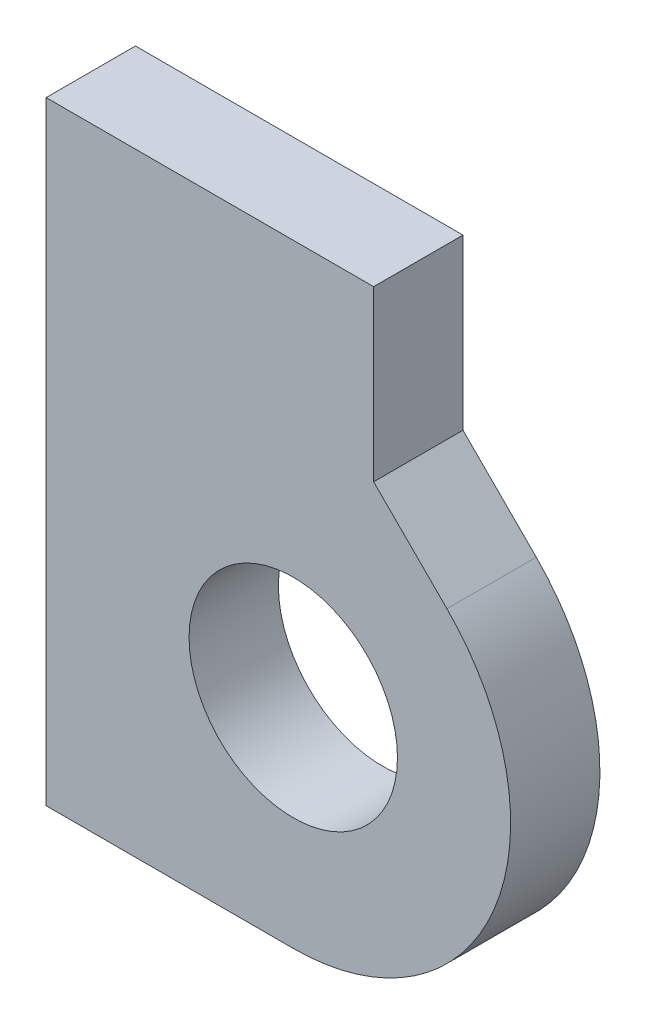
ISO-10303-21;
HEADER;
FILE_DESCRIPTION(('STEP AP214'),'2;1');
FILE_NAME('part.step','',(''),(''),'','','');
FILE_SCHEMA(('AUTOMOTIVE_DESIGN { 1 0 10303 214 1 1 1 1 }'));
ENDSEC;
DATA;
#1=APPLICATION_CONTEXT('core data for automotive mechanical design processes');
#2=APPLICATION_PROTOCOL_DEFINITION('international standard','automotive_design',2000,#1);
#3=PRODUCT_CONTEXT('',#1,'mechanical');
#4=PRODUCT('Part','Part','',(#3));
#5=PRODUCT_RELATED_PRODUCT_CATEGORY('part','',(#4));
#6=PRODUCT_DEFINITION_FORMATION('','',#4);
#7=PRODUCT_DEFINITION_CONTEXT('part definition',#1,'design');
#8=PRODUCT_DEFINITION('design','',#6,#7);
#9=PRODUCT_DEFINITION_SHAPE('','',#8);
#10=(LENGTH_UNIT() NAMED_UNIT(*) SI_UNIT(.MILLI.,.METRE.));
#11=(NAMED_UNIT(*) PLANE_ANGLE_UNIT() SI_UNIT($,.RADIAN.));
#12=(NAMED_UNIT(*) SI_UNIT($,.STERADIAN.) SOLID_ANGLE_UNIT());
#13=UNCERTAINTY_MEASURE_WITH_UNIT(LENGTH_MEASURE(1.E-05),#10,'distance_accuracy_value','');
#14=(GEOMETRIC_REPRESENTATION_CONTEXT(3) GLOBAL_UNCERTAINTY_ASSIGNED_CONTEXT((#13)) GLOBAL_UNIT_ASSIGNED_CONTEXT((#10,
#11,#12)) REPRESENTATION_CONTEXT('',''));
#15=CARTESIAN_POINT('',(0.,0.,0.));
#16=DIRECTION('',(0.,0.,1.));
#17=DIRECTION('',(1.,0.,0.));
#18=AXIS2_PLACEMENT_3D('',#15,#16,#17);
#19=CARTESIAN_POINT('',(83.,-133.,30.));
#20=DIRECTION('',(0.,0.,1.));
#21=DIRECTION('',(1.,0.,0.));
#22=AXIS2_PLACEMENT_3D('',#19,#20,#21);
#23=PLANE('',#22);
#24=DIRECTION('',(0.,-1.,0.));
#25=VECTOR('',#24,1.);
#26=CARTESIAN_POINT('',(0.,0.,30.));
#27=LINE('',#26,#25);
#28=CARTESIAN_POINT('',(0.,0.,30.));
#29=VERTEX_POINT('',#28);
#30=CARTESIAN_POINT('',(0.,-206.,30.));
#31=VERTEX_POINT('',#30);
#32=EDGE_CURVE('E131',#29,#31,#27,.T.);
#33=ORIENTED_EDGE('',*,*,#32,.T.);
#34=DIRECTION('',(1.,0.,0.));
#35=VECTOR('',#34,1.);
#36=CARTESIAN_POINT('',(0.,-206.,30.));
#37=LINE('',#36,#35);
#38=CARTESIAN_POINT('',(83.,-206.,30.));
#39=VERTEX_POINT('',#38);
#40=EDGE_CURVE('E89',#31,#39,#37,.T.);
#41=ORIENTED_EDGE('',*,*,#40,.T.);
#42=CARTESIAN_POINT('',(83.,-133.,30.));
#43=DIRECTION('',(0.,0.,1.));
#44=DIRECTION('',(1.,0.,0.));
#45=AXIS2_PLACEMENT_3D('',#42,#43,#44);
#46=CIRCLE('',#45,73.);
#47=CARTESIAN_POINT('',(134.618795026618,-81.3812049733819,30.));
#48=VERTEX_POINT('',#47);
#49=EDGE_CURVE('E102',#39,#48,#46,.T.);
#50=ORIENTED_EDGE('',*,*,#49,.T.);
#51=DIRECTION('',(-0.707106781186549,0.707106781186546,0.));
#52=VECTOR('',#51,1.);
#53=CARTESIAN_POINT('',(110.,-56.7624099467642,30.));
#54=LINE('',#53,#52);
#55=CARTESIAN_POINT('',(110.,-56.7624099467642,30.));
#56=VERTEX_POINT('',#55);
#57=EDGE_CURVE('E96',#48,#56,#54,.T.);
#58=ORIENTED_EDGE('',*,*,#57,.T.);
#59=DIRECTION('',(0.,1.,0.));
#60=VECTOR('',#59,1.);
#61=CARTESIAN_POINT('',(110.,0.,30.));
#62=LINE('',#61,#60);
#63=CARTESIAN_POINT('',(110.,0.,30.));
#64=VERTEX_POINT('',#63);
#65=EDGE_CURVE('E100',#56,#64,#62,.T.);
#66=ORIENTED_EDGE('',*,*,#65,.T.);
#67=DIRECTION('',(-1.,0.,0.));
#68=VECTOR('',#67,1.);
#69=CARTESIAN_POINT('',(0.,0.,30.));
#70=LINE('',#69,#68);
#71=EDGE_CURVE('E52',#64,#29,#70,.T.);
#72=ORIENTED_EDGE('',*,*,#71,.T.);
#73=EDGE_LOOP('',(#33,#41,#50,#58,#66,#72));
#74=FACE_BOUND('',#73,.T.);
#75=CARTESIAN_POINT('',(83.,-133.,30.));
#76=DIRECTION('',(0.,0.,1.));
#77=DIRECTION('',(1.,0.,0.));
#78=AXIS2_PLACEMENT_3D('',#75,#76,#77);
#79=CIRCLE('',#78,35.);
#80=CARTESIAN_POINT('',(118.,-133.,30.));
#81=VERTEX_POINT('',#80);
#82=EDGE_CURVE('E124',#81,#81,#79,.T.);
#83=ORIENTED_EDGE('',*,*,#82,.F.);
#84=EDGE_LOOP('',(#83));
#85=FACE_BOUND('',#84,.T.);
#86=ADVANCED_FACE('F35',(#74,#85),#23,.T.);
#87=CARTESIAN_POINT('',(83.,-133.,0.));
#88=DIRECTION('',(0.,0.,1.));
#89=DIRECTION('',(1.,0.,0.));
#90=AXIS2_PLACEMENT_3D('',#87,#88,#89);
#91=PLANE('',#90);
#92=DIRECTION('',(0.,-1.,0.));
#93=VECTOR('',#92,1.);
#94=CARTESIAN_POINT('',(0.,0.,0.));
#95=LINE('',#94,#93);
#96=CARTESIAN_POINT('',(0.,0.,0.));
#97=VERTEX_POINT('',#96);
#98=CARTESIAN_POINT('',(0.,-206.,0.));
#99=VERTEX_POINT('',#98);
#100=EDGE_CURVE('E120',#97,#99,#95,.T.);
#101=ORIENTED_EDGE('',*,*,#100,.F.);
#102=DIRECTION('',(-1.,0.,0.));
#103=VECTOR('',#102,1.);
#104=CARTESIAN_POINT('',(0.,0.,0.));
#105=LINE('',#104,#103);
#106=CARTESIAN_POINT('',(110.,0.,0.));
#107=VERTEX_POINT('',#106);
#108=EDGE_CURVE('E81',#107,#97,#105,.T.);
#109=ORIENTED_EDGE('',*,*,#108,.F.);
#110=DIRECTION('',(0.,1.,0.));
#111=VECTOR('',#110,1.);
#112=CARTESIAN_POINT('',(110.,0.,0.));
#113=LINE('',#112,#111);
#114=CARTESIAN_POINT('',(110.,-56.7624099467642,0.));
#115=VERTEX_POINT('',#114);
#116=EDGE_CURVE('E75',#115,#107,#113,.T.);
#117=ORIENTED_EDGE('',*,*,#116,.F.);
#118=DIRECTION('',(-0.707106781186549,0.707106781186546,0.));
#119=VECTOR('',#118,1.);
#120=CARTESIAN_POINT('',(110.,-56.7624099467642,0.));
#121=LINE('',#120,#119);
#122=CARTESIAN_POINT('',(134.618795026618,-81.3812049733819,0.));
#123=VERTEX_POINT('',#122);
#124=EDGE_CURVE('E110',#123,#115,#121,.T.);
#125=ORIENTED_EDGE('',*,*,#124,.F.);
#126=CARTESIAN_POINT('',(83.,-133.,0.));
#127=DIRECTION('',(0.,0.,1.));
#128=DIRECTION('',(1.,0.,0.));
#129=AXIS2_PLACEMENT_3D('',#126,#127,#128);
#130=CIRCLE('',#129,73.);
#131=CARTESIAN_POINT('',(83.,-206.,0.));
#132=VERTEX_POINT('',#131);
#133=EDGE_CURVE('E126',#132,#123,#130,.T.);
#134=ORIENTED_EDGE('',*,*,#133,.F.);
#135=DIRECTION('',(1.,0.,0.));
#136=VECTOR('',#135,1.);
#137=CARTESIAN_POINT('',(0.,-206.,0.));
#138=LINE('',#137,#136);
#139=EDGE_CURVE('E123',#99,#132,#138,.T.);
#140=ORIENTED_EDGE('',*,*,#139,.F.);
#141=EDGE_LOOP('',(#101,#109,#117,#125,#134,#140));
#142=FACE_BOUND('',#141,.T.);
#143=CARTESIAN_POINT('',(83.,-133.,0.));
#144=DIRECTION('',(0.,0.,1.));
#145=DIRECTION('',(1.,0.,0.));
#146=AXIS2_PLACEMENT_3D('',#143,#144,#145);
#147=CIRCLE('',#146,35.);
#148=CARTESIAN_POINT('',(118.,-133.,0.));
#149=VERTEX_POINT('',#148);
#150=EDGE_CURVE('E224',#149,#149,#147,.T.);
#151=ORIENTED_EDGE('',*,*,#150,.T.);
#152=EDGE_LOOP('',(#151));
#153=FACE_BOUND('',#152,.T.);
#154=ADVANCED_FACE('F140',(#142,#153),#91,.F.);
#155=CARTESIAN_POINT('',(0.,0.,30.));
#156=DIRECTION('',(1.,0.,0.));
#157=DIRECTION('',(0.,0.,-1.));
#158=AXIS2_PLACEMENT_3D('',#155,#156,#157);
#159=PLANE('',#158);
#160=ORIENTED_EDGE('',*,*,#100,.T.);
#161=DIRECTION('',(0.,0.,-1.));
#162=VECTOR('',#161,1.);
#163=CARTESIAN_POINT('',(0.,-206.,30.));
#164=LINE('',#163,#162);
#165=EDGE_CURVE('E11',#31,#99,#164,.T.);
#166=ORIENTED_EDGE('',*,*,#165,.F.);
#167=ORIENTED_EDGE('',*,*,#32,.F.);
#168=DIRECTION('',(0.,0.,-1.));
#169=VECTOR('',#168,1.);
#170=CARTESIAN_POINT('',(0.,0.,30.));
#171=LINE('',#170,#169);
#172=EDGE_CURVE('E116',#29,#97,#171,.T.);
#173=ORIENTED_EDGE('',*,*,#172,.T.);
#174=EDGE_LOOP('',(#160,#166,#167,#173));
#175=FACE_BOUND('',#174,.T.);
#176=ADVANCED_FACE('F37',(#175),#159,.F.);
#177=CARTESIAN_POINT('',(0.,-206.,30.));
#178=DIRECTION('',(0.,1.,0.));
#179=DIRECTION('',(0.,0.,1.));
#180=AXIS2_PLACEMENT_3D('',#177,#178,#179);
#181=PLANE('',#180);
#182=ORIENTED_EDGE('',*,*,#139,.T.);
#183=DIRECTION('',(0.,0.,-1.));
#184=VECTOR('',#183,1.);
#185=CARTESIAN_POINT('',(83.,-206.,30.));
#186=LINE('',#185,#184);
#187=EDGE_CURVE('E44',#39,#132,#186,.T.);
#188=ORIENTED_EDGE('',*,*,#187,.F.);
#189=ORIENTED_EDGE('',*,*,#40,.F.);
#190=ORIENTED_EDGE('',*,*,#165,.T.);
#191=EDGE_LOOP('',(#182,#188,#189,#190));
#192=FACE_BOUND('',#191,.T.);
#193=ADVANCED_FACE('F165',(#192),#181,.F.);
#194=CARTESIAN_POINT('',(83.,-133.,30.));
#195=DIRECTION('',(0.,0.,-1.));
#196=DIRECTION('',(-1.,0.,0.));
#197=AXIS2_PLACEMENT_3D('',#194,#195,#196);
#198=CYLINDRICAL_SURFACE('',#197,73.);
#199=ORIENTED_EDGE('',*,*,#133,.T.);
#200=DIRECTION('',(0.,0.,-1.));
#201=VECTOR('',#200,1.);
#202=CARTESIAN_POINT('',(134.618795026618,-81.3812049733819,30.));
#203=LINE('',#202,#201);
#204=EDGE_CURVE('E111',#48,#123,#203,.T.);
#205=ORIENTED_EDGE('',*,*,#204,.F.);
#206=ORIENTED_EDGE('',*,*,#49,.F.);
#207=ORIENTED_EDGE('',*,*,#187,.T.);
#208=EDGE_LOOP('',(#199,#205,#206,#207));
#209=FACE_BOUND('',#208,.T.);
#210=ADVANCED_FACE('F137',(#209),#198,.T.);
#211=CARTESIAN_POINT('',(110.,-56.7624099467642,30.));
#212=DIRECTION('',(-0.707106781186546,-0.707106781186549,0.));
#213=DIRECTION('',(0.707106781186549,-0.707106781186546,0.));
#214=AXIS2_PLACEMENT_3D('',#211,#212,#213);
#215=PLANE('',#214);
#216=ORIENTED_EDGE('',*,*,#124,.T.);
#217=DIRECTION('',(0.,0.,-1.));
#218=VECTOR('',#217,1.);
#219=CARTESIAN_POINT('',(110.,-56.7624099467642,30.));
#220=LINE('',#219,#218);
#221=EDGE_CURVE('E107',#56,#115,#220,.T.);
#222=ORIENTED_EDGE('',*,*,#221,.F.);
#223=ORIENTED_EDGE('',*,*,#57,.F.);
#224=ORIENTED_EDGE('',*,*,#204,.T.);
#225=EDGE_LOOP('',(#216,#222,#223,#224));
#226=FACE_BOUND('',#225,.T.);
#227=ADVANCED_FACE('F108',(#226),#215,.F.);
#228=CARTESIAN_POINT('',(110.,0.,30.));
#229=DIRECTION('',(-1.,0.,0.));
#230=DIRECTION('',(0.,-1.,0.));
#231=AXIS2_PLACEMENT_3D('',#228,#229,#230);
#232=PLANE('',#231);
#233=ORIENTED_EDGE('',*,*,#116,.T.);
#234=DIRECTION('',(0.,0.,-1.));
#235=VECTOR('',#234,1.);
#236=CARTESIAN_POINT('',(110.,0.,30.));
#237=LINE('',#236,#235);
#238=EDGE_CURVE('E112',#64,#107,#237,.T.);
#239=ORIENTED_EDGE('',*,*,#238,.F.);
#240=ORIENTED_EDGE('',*,*,#65,.F.);
#241=ORIENTED_EDGE('',*,*,#221,.T.);
#242=EDGE_LOOP('',(#233,#239,#240,#241));
#243=FACE_BOUND('',#242,.T.);
#244=ADVANCED_FACE('F114',(#243),#232,.F.);
#245=CARTESIAN_POINT('',(0.,0.,30.));
#246=DIRECTION('',(0.,-1.,0.));
#247=DIRECTION('',(0.,0.,-1.));
#248=AXIS2_PLACEMENT_3D('',#245,#246,#247);
#249=PLANE('',#248);
#250=ORIENTED_EDGE('',*,*,#108,.T.);
#251=ORIENTED_EDGE('',*,*,#172,.F.);
#252=ORIENTED_EDGE('',*,*,#71,.F.);
#253=ORIENTED_EDGE('',*,*,#238,.T.);
#254=EDGE_LOOP('',(#250,#251,#252,#253));
#255=FACE_BOUND('',#254,.T.);
#256=ADVANCED_FACE('F145',(#255),#249,.F.);
#257=CARTESIAN_POINT('',(83.,-133.,30.));
#258=DIRECTION('',(0.,0.,-1.));
#259=DIRECTION('',(-1.,0.,0.));
#260=AXIS2_PLACEMENT_3D('',#257,#258,#259);
#261=CYLINDRICAL_SURFACE('',#260,35.);
#262=ORIENTED_EDGE('',*,*,#82,.T.);
#263=EDGE_LOOP('',(#262));
#264=FACE_BOUND('',#263,.T.);
#265=ORIENTED_EDGE('',*,*,#150,.F.);
#266=EDGE_LOOP('',(#265));
#267=FACE_BOUND('',#266,.T.);
#268=ADVANCED_FACE('F147',(#264,#267),#261,.F.);
#269=CLOSED_SHELL('',(#86,#154,#176,#193,#210,#227,#244,#256,#268));
#270=MANIFOLD_SOLID_BREP('B2',#269);
#271=ADVANCED_BREP_SHAPE_REPRESENTATION('',(#18,#270),#14);
#272=SHAPE_DEFINITION_REPRESENTATION(#9,#271);
ENDSEC;
END-ISO-10303-21;
